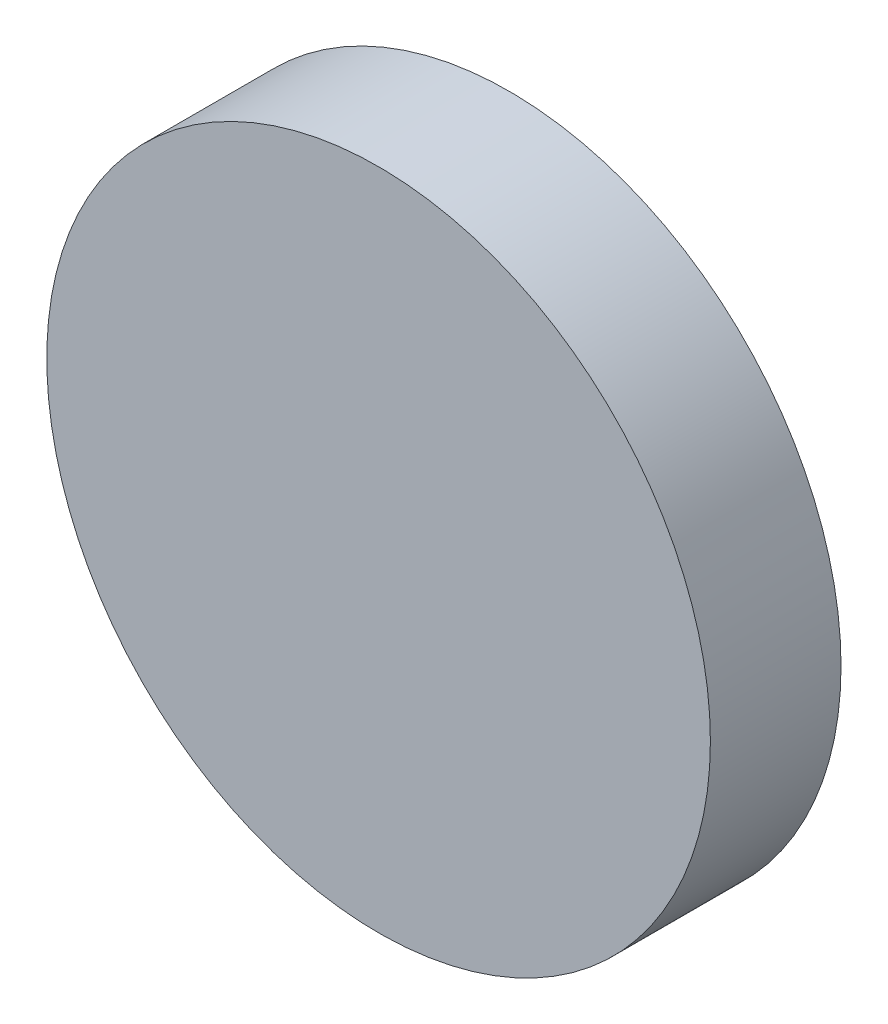
ISO-10303-21;
HEADER;
FILE_DESCRIPTION(('STEP AP214'),'2;1');
FILE_NAME('part.step','',(''),(''),'','','');
FILE_SCHEMA(('AUTOMOTIVE_DESIGN { 1 0 10303 214 1 1 1 1 }'));
ENDSEC;
DATA;
#1=APPLICATION_CONTEXT('core data for automotive mechanical design processes');
#2=APPLICATION_PROTOCOL_DEFINITION('international standard','automotive_design',2000,#1);
#3=PRODUCT_CONTEXT('',#1,'mechanical');
#4=PRODUCT('Part','Part','',(#3));
#5=PRODUCT_RELATED_PRODUCT_CATEGORY('part','',(#4));
#6=PRODUCT_DEFINITION_FORMATION('','',#4);
#7=PRODUCT_DEFINITION_CONTEXT('part definition',#1,'design');
#8=PRODUCT_DEFINITION('design','',#6,#7);
#9=PRODUCT_DEFINITION_SHAPE('','',#8);
#10=(LENGTH_UNIT() NAMED_UNIT(*) SI_UNIT(.MILLI.,.METRE.));
#11=(NAMED_UNIT(*) PLANE_ANGLE_UNIT() SI_UNIT($,.RADIAN.));
#12=(NAMED_UNIT(*) SI_UNIT($,.STERADIAN.) SOLID_ANGLE_UNIT());
#13=UNCERTAINTY_MEASURE_WITH_UNIT(LENGTH_MEASURE(1.E-05),#10,'distance_accuracy_value','');
#14=(GEOMETRIC_REPRESENTATION_CONTEXT(3) GLOBAL_UNCERTAINTY_ASSIGNED_CONTEXT((#13)) GLOBAL_UNIT_ASSIGNED_CONTEXT((#10,
#11,#12)) REPRESENTATION_CONTEXT('',''));
#15=CARTESIAN_POINT('',(0.,0.,0.));
#16=DIRECTION('',(0.,0.,1.));
#17=DIRECTION('',(1.,0.,0.));
#18=AXIS2_PLACEMENT_3D('',#15,#16,#17);
#19=CARTESIAN_POINT('',(0.,0.,10.));
#20=DIRECTION('',(0.,0.,-1.));
#21=DIRECTION('',(-1.,0.,0.));
#22=AXIS2_PLACEMENT_3D('',#19,#20,#21);
#23=CYLINDRICAL_SURFACE('',#22,25.4);
#24=CARTESIAN_POINT('',(0.,0.,10.));
#25=DIRECTION('',(0.,0.,1.));
#26=DIRECTION('',(1.,0.,0.));
#27=AXIS2_PLACEMENT_3D('',#24,#25,#26);
#28=CIRCLE('',#27,25.4);
#29=CARTESIAN_POINT('',(25.4,0.,10.));
#30=VERTEX_POINT('',#29);
#31=EDGE_CURVE('E10',#30,#30,#28,.T.);
#32=ORIENTED_EDGE('',*,*,#31,.F.);
#33=EDGE_LOOP('',(#32));
#34=FACE_BOUND('',#33,.T.);
#35=CARTESIAN_POINT('',(0.,0.,0.));
#36=DIRECTION('',(0.,0.,1.));
#37=DIRECTION('',(1.,0.,0.));
#38=AXIS2_PLACEMENT_3D('',#35,#36,#37);
#39=CIRCLE('',#38,25.4);
#40=CARTESIAN_POINT('',(25.4,0.,0.));
#41=VERTEX_POINT('',#40);
#42=EDGE_CURVE('E40',#41,#41,#39,.T.);
#43=ORIENTED_EDGE('',*,*,#42,.T.);
#44=EDGE_LOOP('',(#43));
#45=FACE_BOUND('',#44,.T.);
#46=ADVANCED_FACE('F37',(#34,#45),#23,.T.);
#47=CARTESIAN_POINT('',(0.,0.,10.));
#48=DIRECTION('',(0.,0.,1.));
#49=DIRECTION('',(1.,0.,0.));
#50=AXIS2_PLACEMENT_3D('',#47,#48,#49);
#51=PLANE('',#50);
#52=ORIENTED_EDGE('',*,*,#31,.T.);
#53=EDGE_LOOP('',(#52));
#54=FACE_BOUND('',#53,.T.);
#55=ADVANCED_FACE('F52',(#54),#51,.T.);
#56=CARTESIAN_POINT('',(0.,0.,0.));
#57=DIRECTION('',(0.,0.,1.));
#58=DIRECTION('',(1.,0.,0.));
#59=AXIS2_PLACEMENT_3D('',#56,#57,#58);
#60=PLANE('',#59);
#61=ORIENTED_EDGE('',*,*,#42,.F.);
#62=EDGE_LOOP('',(#61));
#63=FACE_BOUND('',#62,.T.);
#64=ADVANCED_FACE('F50',(#63),#60,.F.);
#65=CLOSED_SHELL('',(#46,#55,#64));
#66=MANIFOLD_SOLID_BREP('B2',#65);
#67=ADVANCED_BREP_SHAPE_REPRESENTATION('',(#18,#66),#14);
#68=SHAPE_DEFINITION_REPRESENTATION(#9,#67);
ENDSEC;
END-ISO-10303-21;
